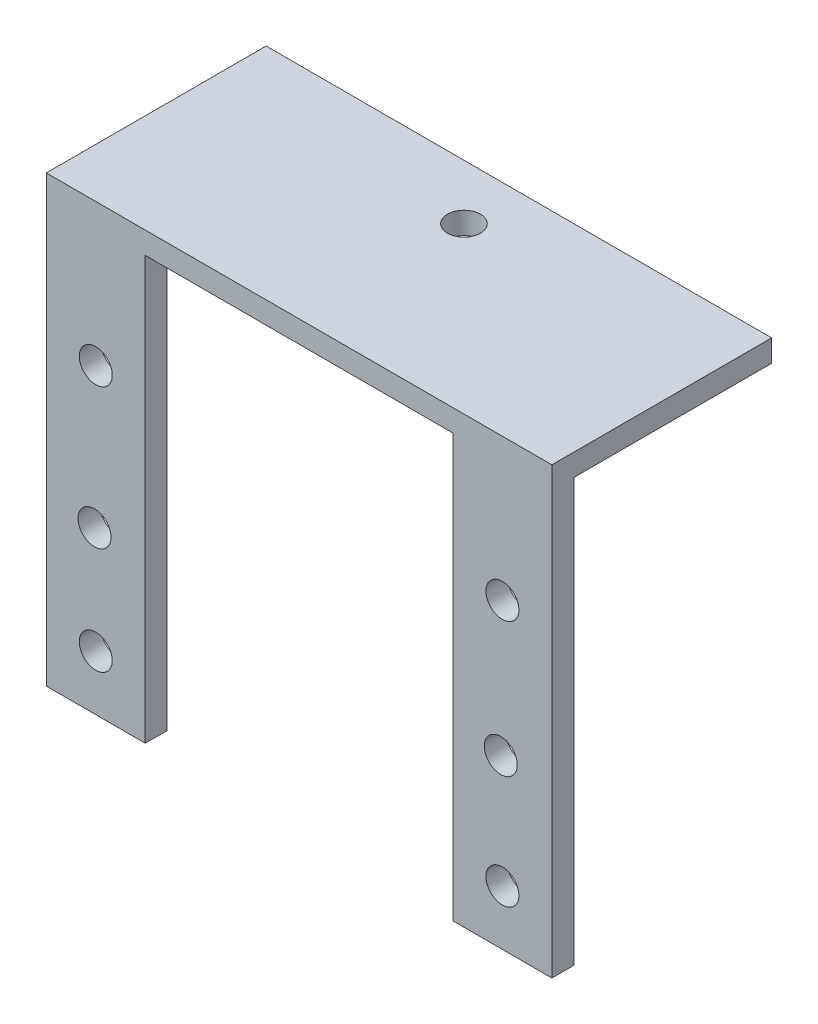
ISO-10303-21;
HEADER;
FILE_DESCRIPTION(('STEP AP214'),'2;1');
FILE_NAME('part.step','',(''),(''),'','','');
FILE_SCHEMA(('AUTOMOTIVE_DESIGN { 1 0 10303 214 1 1 1 1 }'));
ENDSEC;
DATA;
#1=APPLICATION_CONTEXT('core data for automotive mechanical design processes');
#2=APPLICATION_PROTOCOL_DEFINITION('international standard','automotive_design',2000,#1);
#3=PRODUCT_CONTEXT('',#1,'mechanical');
#4=PRODUCT('Part','Part','',(#3));
#5=PRODUCT_RELATED_PRODUCT_CATEGORY('part','',(#4));
#6=PRODUCT_DEFINITION_FORMATION('','',#4);
#7=PRODUCT_DEFINITION_CONTEXT('part definition',#1,'design');
#8=PRODUCT_DEFINITION('design','',#6,#7);
#9=PRODUCT_DEFINITION_SHAPE('','',#8);
#10=(LENGTH_UNIT() NAMED_UNIT(*) SI_UNIT(.MILLI.,.METRE.));
#11=(NAMED_UNIT(*) PLANE_ANGLE_UNIT() SI_UNIT($,.RADIAN.));
#12=(NAMED_UNIT(*) SI_UNIT($,.STERADIAN.) SOLID_ANGLE_UNIT());
#13=UNCERTAINTY_MEASURE_WITH_UNIT(LENGTH_MEASURE(1.E-05),#10,'distance_accuracy_value','');
#14=(GEOMETRIC_REPRESENTATION_CONTEXT(3) GLOBAL_UNCERTAINTY_ASSIGNED_CONTEXT((#13)) GLOBAL_UNIT_ASSIGNED_CONTEXT((#10,
#11,#12)) REPRESENTATION_CONTEXT('',''));
#15=CARTESIAN_POINT('',(0.,0.,0.));
#16=DIRECTION('',(0.,0.,1.));
#17=DIRECTION('',(1.,0.,0.));
#18=AXIS2_PLACEMENT_3D('',#15,#16,#17);
#19=CARTESIAN_POINT('',(0.,4.,0.));
#20=DIRECTION('',(0.,-1.,0.));
#21=DIRECTION('',(0.,0.,-1.));
#22=AXIS2_PLACEMENT_3D('',#19,#20,#21);
#23=PLANE('',#22);
#24=CARTESIAN_POINT('',(-2.51580828835598,4.,-13.));
#25=DIRECTION('',(0.,1.,0.));
#26=DIRECTION('',(0.,0.,1.));
#27=AXIS2_PLACEMENT_3D('',#24,#25,#26);
#28=CIRCLE('',#27,1.5);
#29=CARTESIAN_POINT('',(-2.51580828835598,4.,-11.5));
#30=VERTEX_POINT('',#29);
#31=EDGE_CURVE('E176',#30,#30,#28,.T.);
#32=ORIENTED_EDGE('',*,*,#31,.T.);
#33=EDGE_LOOP('',(#32));
#34=FACE_BOUND('',#33,.T.);
#35=DIRECTION('',(0.,0.,-1.));
#36=VECTOR('',#35,1.);
#37=CARTESIAN_POINT('',(20.484191711644,4.,2.));
#38=LINE('',#37,#36);
#39=CARTESIAN_POINT('',(20.484191711644,4.,0.));
#40=VERTEX_POINT('',#39);
#41=CARTESIAN_POINT('',(20.484191711644,4.,-18.));
#42=VERTEX_POINT('',#41);
#43=EDGE_CURVE('E210',#40,#42,#38,.T.);
#44=ORIENTED_EDGE('',*,*,#43,.F.);
#45=DIRECTION('',(-1.,0.,0.));
#46=VECTOR('',#45,1.);
#47=CARTESIAN_POINT('',(0.,4.,0.));
#48=LINE('',#47,#46);
#49=CARTESIAN_POINT('',(11.484191711644,4.,0.));
#50=VERTEX_POINT('',#49);
#51=EDGE_CURVE('E172',#40,#50,#48,.T.);
#52=ORIENTED_EDGE('',*,*,#51,.T.);
#53=DIRECTION('',(0.,0.,1.));
#54=VECTOR('',#53,1.);
#55=CARTESIAN_POINT('',(11.484191711644,4.,0.));
#56=LINE('',#55,#54);
#57=CARTESIAN_POINT('',(11.484191711644,4.,2.));
#58=VERTEX_POINT('',#57);
#59=EDGE_CURVE('E11',#50,#58,#56,.T.);
#60=ORIENTED_EDGE('',*,*,#59,.T.);
#61=DIRECTION('',(1.,0.,0.));
#62=VECTOR('',#61,1.);
#63=CARTESIAN_POINT('',(-25.515808288356,4.,2.));
#64=LINE('',#63,#62);
#65=CARTESIAN_POINT('',(-16.515808288356,4.,2.));
#66=VERTEX_POINT('',#65);
#67=EDGE_CURVE('E206',#66,#58,#64,.T.);
#68=ORIENTED_EDGE('',*,*,#67,.F.);
#69=DIRECTION('',(0.,0.,1.));
#70=VECTOR('',#69,1.);
#71=CARTESIAN_POINT('',(-16.515808288356,4.,2.));
#72=LINE('',#71,#70);
#73=CARTESIAN_POINT('',(-16.515808288356,4.,0.));
#74=VERTEX_POINT('',#73);
#75=EDGE_CURVE('E228',#74,#66,#72,.T.);
#76=ORIENTED_EDGE('',*,*,#75,.F.);
#77=DIRECTION('',(1.,0.,0.));
#78=VECTOR('',#77,1.);
#79=CARTESIAN_POINT('',(0.,4.,0.));
#80=LINE('',#79,#78);
#81=CARTESIAN_POINT('',(-25.515808288356,4.,0.));
#82=VERTEX_POINT('',#81);
#83=EDGE_CURVE('E100',#82,#74,#80,.T.);
#84=ORIENTED_EDGE('',*,*,#83,.F.);
#85=DIRECTION('',(0.,0.,1.));
#86=VECTOR('',#85,1.);
#87=CARTESIAN_POINT('',(-25.515808288356,4.,2.));
#88=LINE('',#87,#86);
#89=CARTESIAN_POINT('',(-25.515808288356,4.,-18.));
#90=VERTEX_POINT('',#89);
#91=EDGE_CURVE('E181',#90,#82,#88,.T.);
#92=ORIENTED_EDGE('',*,*,#91,.F.);
#93=DIRECTION('',(-1.,0.,0.));
#94=VECTOR('',#93,1.);
#95=CARTESIAN_POINT('',(-25.515808288356,4.,-18.));
#96=LINE('',#95,#94);
#97=EDGE_CURVE('E190',#42,#90,#96,.T.);
#98=ORIENTED_EDGE('',*,*,#97,.F.);
#99=EDGE_LOOP('',(#44,#52,#60,#68,#76,#84,#92,#98));
#100=FACE_BOUND('',#99,.T.);
#101=ADVANCED_FACE('F38',(#34,#100),#23,.T.);
#102=CARTESIAN_POINT('',(0.,0.,2.));
#103=DIRECTION('',(0.,0.,1.));
#104=DIRECTION('',(1.,0.,0.));
#105=AXIS2_PLACEMENT_3D('',#102,#103,#104);
#106=PLANE('',#105);
#107=CARTESIAN_POINT('',(-21.1275313154005,-19.770890516682,2.));
#108=DIRECTION('',(0.,0.,1.));
#109=DIRECTION('',(1.,0.,0.));
#110=AXIS2_PLACEMENT_3D('',#107,#108,#109);
#111=CIRCLE('',#110,1.5);
#112=CARTESIAN_POINT('',(-19.6275313154005,-19.770890516682,2.));
#113=VERTEX_POINT('',#112);
#114=EDGE_CURVE('E132',#113,#113,#111,.T.);
#115=ORIENTED_EDGE('',*,*,#114,.F.);
#116=EDGE_LOOP('',(#115));
#117=FACE_BOUND('',#116,.T.);
#118=CARTESIAN_POINT('',(15.8340917018336,-19.2316304957956,2.));
#119=DIRECTION('',(0.,0.,1.));
#120=DIRECTION('',(1.,0.,0.));
#121=AXIS2_PLACEMENT_3D('',#118,#119,#120);
#122=CIRCLE('',#121,1.5);
#123=CARTESIAN_POINT('',(17.3340917018336,-19.2316304957956,2.));
#124=VERTEX_POINT('',#123);
#125=EDGE_CURVE('E118',#124,#124,#122,.T.);
#126=ORIENTED_EDGE('',*,*,#125,.F.);
#127=EDGE_LOOP('',(#126));
#128=FACE_BOUND('',#127,.T.);
#129=DIRECTION('',(1.,0.,0.));
#130=VECTOR('',#129,1.);
#131=CARTESIAN_POINT('',(20.484191711644,-34.4383287652777,2.));
#132=LINE('',#131,#130);
#133=CARTESIAN_POINT('',(11.484191711644,-34.4383287652777,2.));
#134=VERTEX_POINT('',#133);
#135=CARTESIAN_POINT('',(20.484191711644,-34.4383287652777,2.));
#136=VERTEX_POINT('',#135);
#137=EDGE_CURVE('E149',#134,#136,#132,.T.);
#138=ORIENTED_EDGE('',*,*,#137,.T.);
#139=DIRECTION('',(0.,-1.,0.));
#140=VECTOR('',#139,1.);
#141=CARTESIAN_POINT('',(20.484191711644,6.,2.));
#142=LINE('',#141,#140);
#143=CARTESIAN_POINT('',(20.484191711644,6.,2.));
#144=VERTEX_POINT('',#143);
#145=EDGE_CURVE('E224',#144,#136,#142,.T.);
#146=ORIENTED_EDGE('',*,*,#145,.F.);
#147=DIRECTION('',(1.,0.,0.));
#148=VECTOR('',#147,1.);
#149=CARTESIAN_POINT('',(-25.515808288356,6.,2.));
#150=LINE('',#149,#148);
#151=CARTESIAN_POINT('',(-25.515808288356,6.,2.));
#152=VERTEX_POINT('',#151);
#153=EDGE_CURVE('E189',#152,#144,#150,.T.);
#154=ORIENTED_EDGE('',*,*,#153,.F.);
#155=DIRECTION('',(0.,-1.,0.));
#156=VECTOR('',#155,1.);
#157=CARTESIAN_POINT('',(-25.515808288356,-34.4383287652777,2.));
#158=LINE('',#157,#156);
#159=CARTESIAN_POINT('',(-25.515808288356,-34.4383287652777,2.));
#160=VERTEX_POINT('',#159);
#161=EDGE_CURVE('E245',#152,#160,#158,.T.);
#162=ORIENTED_EDGE('',*,*,#161,.T.);
#163=DIRECTION('',(1.,0.,0.));
#164=VECTOR('',#163,1.);
#165=CARTESIAN_POINT('',(-16.515808288356,-34.4383287652777,2.));
#166=LINE('',#165,#164);
#167=CARTESIAN_POINT('',(-16.515808288356,-34.4383287652777,2.));
#168=VERTEX_POINT('',#167);
#169=EDGE_CURVE('E64',#160,#168,#166,.T.);
#170=ORIENTED_EDGE('',*,*,#169,.T.);
#171=DIRECTION('',(0.,1.,0.));
#172=VECTOR('',#171,1.);
#173=CARTESIAN_POINT('',(-16.515808288356,-34.4383287652777,2.));
#174=LINE('',#173,#172);
#175=EDGE_CURVE('E87',#168,#66,#174,.T.);
#176=ORIENTED_EDGE('',*,*,#175,.T.);
#177=ORIENTED_EDGE('',*,*,#67,.T.);
#178=DIRECTION('',(0.,-1.,0.));
#179=VECTOR('',#178,1.);
#180=CARTESIAN_POINT('',(11.484191711644,-34.4383287652777,2.));
#181=LINE('',#180,#179);
#182=EDGE_CURVE('E56',#58,#134,#181,.T.);
#183=ORIENTED_EDGE('',*,*,#182,.T.);
#184=EDGE_LOOP('',(#138,#146,#154,#162,#170,#176,#177,#183));
#185=FACE_BOUND('',#184,.T.);
#186=CARTESIAN_POINT('',(15.984191711644,-29.4383287652777,2.));
#187=DIRECTION('',(0.,0.,1.));
#188=DIRECTION('',(1.,0.,0.));
#189=AXIS2_PLACEMENT_3D('',#186,#187,#188);
#190=CIRCLE('',#189,1.5);
#191=CARTESIAN_POINT('',(17.484191711644,-29.4383287652777,2.));
#192=VERTEX_POINT('',#191);
#193=EDGE_CURVE('E139',#192,#192,#190,.T.);
#194=ORIENTED_EDGE('',*,*,#193,.F.);
#195=EDGE_LOOP('',(#194));
#196=FACE_BOUND('',#195,.T.);
#197=CARTESIAN_POINT('',(15.984191711644,-6.93832876527765,2.));
#198=DIRECTION('',(0.,0.,1.));
#199=DIRECTION('',(1.,0.,0.));
#200=AXIS2_PLACEMENT_3D('',#197,#198,#199);
#201=CIRCLE('',#200,1.5);
#202=CARTESIAN_POINT('',(17.484191711644,-6.93832876527765,2.));
#203=VERTEX_POINT('',#202);
#204=EDGE_CURVE('E124',#203,#203,#201,.T.);
#205=ORIENTED_EDGE('',*,*,#204,.F.);
#206=EDGE_LOOP('',(#205));
#207=FACE_BOUND('',#206,.T.);
#208=CARTESIAN_POINT('',(-21.015808288356,-29.4383287652777,2.));
#209=DIRECTION('',(0.,0.,1.));
#210=DIRECTION('',(1.,0.,0.));
#211=AXIS2_PLACEMENT_3D('',#208,#209,#210);
#212=CIRCLE('',#211,1.5);
#213=CARTESIAN_POINT('',(-19.515808288356,-29.4383287652777,2.));
#214=VERTEX_POINT('',#213);
#215=EDGE_CURVE('E102',#214,#214,#212,.T.);
#216=ORIENTED_EDGE('',*,*,#215,.F.);
#217=EDGE_LOOP('',(#216));
#218=FACE_BOUND('',#217,.T.);
#219=CARTESIAN_POINT('',(-21.015808288356,-6.93832876527765,2.));
#220=DIRECTION('',(0.,0.,1.));
#221=DIRECTION('',(1.,0.,0.));
#222=AXIS2_PLACEMENT_3D('',#219,#220,#221);
#223=CIRCLE('',#222,1.5);
#224=CARTESIAN_POINT('',(-19.515808288356,-6.93832876527765,2.));
#225=VERTEX_POINT('',#224);
#226=EDGE_CURVE('E234',#225,#225,#223,.T.);
#227=ORIENTED_EDGE('',*,*,#226,.F.);
#228=EDGE_LOOP('',(#227));
#229=FACE_BOUND('',#228,.T.);
#230=ADVANCED_FACE('F250',(#117,#128,#185,#196,#207,#218,#229),#106,.T.);
#231=CARTESIAN_POINT('',(0.,0.,0.));
#232=DIRECTION('',(0.,0.,1.));
#233=DIRECTION('',(1.,0.,0.));
#234=AXIS2_PLACEMENT_3D('',#231,#232,#233);
#235=PLANE('',#234);
#236=CARTESIAN_POINT('',(-21.1275313154005,-19.770890516682,0.));
#237=DIRECTION('',(0.,0.,1.));
#238=DIRECTION('',(1.,0.,0.));
#239=AXIS2_PLACEMENT_3D('',#236,#237,#238);
#240=CIRCLE('',#239,1.5);
#241=CARTESIAN_POINT('',(-19.6275313154005,-19.770890516682,0.));
#242=VERTEX_POINT('',#241);
#243=EDGE_CURVE('E42',#242,#242,#240,.T.);
#244=ORIENTED_EDGE('',*,*,#243,.T.);
#245=EDGE_LOOP('',(#244));
#246=FACE_BOUND('',#245,.T.);
#247=DIRECTION('',(0.,-1.,0.));
#248=VECTOR('',#247,1.);
#249=CARTESIAN_POINT('',(-25.515808288356,-34.4383287652777,0.));
#250=LINE('',#249,#248);
#251=CARTESIAN_POINT('',(-25.515808288356,-34.4383287652777,0.));
#252=VERTEX_POINT('',#251);
#253=EDGE_CURVE('E88',#82,#252,#250,.T.);
#254=ORIENTED_EDGE('',*,*,#253,.F.);
#255=ORIENTED_EDGE('',*,*,#83,.T.);
#256=DIRECTION('',(0.,1.,0.));
#257=VECTOR('',#256,1.);
#258=CARTESIAN_POINT('',(-16.515808288356,-34.4383287652777,0.));
#259=LINE('',#258,#257);
#260=CARTESIAN_POINT('',(-16.515808288356,-34.4383287652777,0.));
#261=VERTEX_POINT('',#260);
#262=EDGE_CURVE('E93',#261,#74,#259,.T.);
#263=ORIENTED_EDGE('',*,*,#262,.F.);
#264=DIRECTION('',(1.,0.,0.));
#265=VECTOR('',#264,1.);
#266=CARTESIAN_POINT('',(-16.515808288356,-34.4383287652777,0.));
#267=LINE('',#266,#265);
#268=EDGE_CURVE('E77',#252,#261,#267,.T.);
#269=ORIENTED_EDGE('',*,*,#268,.F.);
#270=EDGE_LOOP('',(#254,#255,#263,#269));
#271=FACE_BOUND('',#270,.T.);
#272=CARTESIAN_POINT('',(-21.015808288356,-29.4383287652777,0.));
#273=DIRECTION('',(0.,0.,1.));
#274=DIRECTION('',(1.,0.,0.));
#275=AXIS2_PLACEMENT_3D('',#272,#273,#274);
#276=CIRCLE('',#275,1.5);
#277=CARTESIAN_POINT('',(-19.515808288356,-29.4383287652777,0.));
#278=VERTEX_POINT('',#277);
#279=EDGE_CURVE('E108',#278,#278,#276,.T.);
#280=ORIENTED_EDGE('',*,*,#279,.T.);
#281=EDGE_LOOP('',(#280));
#282=FACE_BOUND('',#281,.T.);
#283=CARTESIAN_POINT('',(-21.015808288356,-6.93832876527765,0.));
#284=DIRECTION('',(0.,0.,1.));
#285=DIRECTION('',(1.,0.,0.));
#286=AXIS2_PLACEMENT_3D('',#283,#284,#285);
#287=CIRCLE('',#286,1.5);
#288=CARTESIAN_POINT('',(-19.515808288356,-6.93832876527765,0.));
#289=VERTEX_POINT('',#288);
#290=EDGE_CURVE('E233',#289,#289,#287,.T.);
#291=ORIENTED_EDGE('',*,*,#290,.T.);
#292=EDGE_LOOP('',(#291));
#293=FACE_BOUND('',#292,.T.);
#294=ADVANCED_FACE('F97',(#246,#271,#282,#293),#235,.F.);
#295=CARTESIAN_POINT('',(-16.515808288356,-34.4383287652777,2.));
#296=DIRECTION('',(-1.,0.,0.));
#297=DIRECTION('',(0.,0.,1.));
#298=AXIS2_PLACEMENT_3D('',#295,#296,#297);
#299=PLANE('',#298);
#300=ORIENTED_EDGE('',*,*,#262,.T.);
#301=ORIENTED_EDGE('',*,*,#75,.T.);
#302=ORIENTED_EDGE('',*,*,#175,.F.);
#303=DIRECTION('',(0.,0.,-1.));
#304=VECTOR('',#303,1.);
#305=CARTESIAN_POINT('',(-16.515808288356,-34.4383287652777,2.));
#306=LINE('',#305,#304);
#307=EDGE_CURVE('E80',#168,#261,#306,.T.);
#308=ORIENTED_EDGE('',*,*,#307,.T.);
#309=EDGE_LOOP('',(#300,#301,#302,#308));
#310=FACE_BOUND('',#309,.T.);
#311=ADVANCED_FACE('F40',(#310),#299,.F.);
#312=CARTESIAN_POINT('',(-25.515808288356,-34.4383287652777,2.));
#313=DIRECTION('',(1.,0.,0.));
#314=DIRECTION('',(0.,0.,-1.));
#315=AXIS2_PLACEMENT_3D('',#312,#313,#314);
#316=PLANE('',#315);
#317=ORIENTED_EDGE('',*,*,#91,.T.);
#318=ORIENTED_EDGE('',*,*,#253,.T.);
#319=DIRECTION('',(0.,0.,-1.));
#320=VECTOR('',#319,1.);
#321=CARTESIAN_POINT('',(-25.515808288356,-34.4383287652777,2.));
#322=LINE('',#321,#320);
#323=EDGE_CURVE('E48',#160,#252,#322,.T.);
#324=ORIENTED_EDGE('',*,*,#323,.F.);
#325=ORIENTED_EDGE('',*,*,#161,.F.);
#326=DIRECTION('',(0.,0.,1.));
#327=VECTOR('',#326,1.);
#328=CARTESIAN_POINT('',(-25.515808288356,6.,2.));
#329=LINE('',#328,#327);
#330=CARTESIAN_POINT('',(-25.515808288356,6.,-18.));
#331=VERTEX_POINT('',#330);
#332=EDGE_CURVE('E185',#331,#152,#329,.T.);
#333=ORIENTED_EDGE('',*,*,#332,.F.);
#334=DIRECTION('',(0.,-1.,0.));
#335=VECTOR('',#334,1.);
#336=CARTESIAN_POINT('',(-25.515808288356,6.,-18.));
#337=LINE('',#336,#335);
#338=EDGE_CURVE('E202',#331,#90,#337,.T.);
#339=ORIENTED_EDGE('',*,*,#338,.T.);
#340=EDGE_LOOP('',(#317,#318,#324,#325,#333,#339));
#341=FACE_BOUND('',#340,.T.);
#342=ADVANCED_FACE('F256',(#341),#316,.F.);
#343=CARTESIAN_POINT('',(-16.515808288356,-34.4383287652777,2.));
#344=DIRECTION('',(0.,1.,0.));
#345=DIRECTION('',(0.,0.,1.));
#346=AXIS2_PLACEMENT_3D('',#343,#344,#345);
#347=PLANE('',#346);
#348=ORIENTED_EDGE('',*,*,#268,.T.);
#349=ORIENTED_EDGE('',*,*,#307,.F.);
#350=ORIENTED_EDGE('',*,*,#169,.F.);
#351=ORIENTED_EDGE('',*,*,#323,.T.);
#352=EDGE_LOOP('',(#348,#349,#350,#351));
#353=FACE_BOUND('',#352,.T.);
#354=ADVANCED_FACE('F79',(#353),#347,.F.);
#355=CARTESIAN_POINT('',(-21.015808288356,-29.4383287652777,2.));
#356=DIRECTION('',(0.,0.,-1.));
#357=DIRECTION('',(-1.,0.,0.));
#358=AXIS2_PLACEMENT_3D('',#355,#356,#357);
#359=CYLINDRICAL_SURFACE('',#358,1.5);
#360=ORIENTED_EDGE('',*,*,#215,.T.);
#361=EDGE_LOOP('',(#360));
#362=FACE_BOUND('',#361,.T.);
#363=ORIENTED_EDGE('',*,*,#279,.F.);
#364=EDGE_LOOP('',(#363));
#365=FACE_BOUND('',#364,.T.);
#366=ADVANCED_FACE('F339',(#362,#365),#359,.F.);
#367=CARTESIAN_POINT('',(-21.015808288356,-6.93832876527765,2.));
#368=DIRECTION('',(0.,0.,-1.));
#369=DIRECTION('',(-1.,0.,0.));
#370=AXIS2_PLACEMENT_3D('',#367,#368,#369);
#371=CYLINDRICAL_SURFACE('',#370,1.5);
#372=ORIENTED_EDGE('',*,*,#226,.T.);
#373=EDGE_LOOP('',(#372));
#374=FACE_BOUND('',#373,.T.);
#375=ORIENTED_EDGE('',*,*,#290,.F.);
#376=EDGE_LOOP('',(#375));
#377=FACE_BOUND('',#376,.T.);
#378=ADVANCED_FACE('F314',(#374,#377),#371,.F.);
#379=CARTESIAN_POINT('',(0.,6.,0.));
#380=DIRECTION('',(0.,-1.,0.));
#381=DIRECTION('',(0.,0.,-1.));
#382=AXIS2_PLACEMENT_3D('',#379,#380,#381);
#383=PLANE('',#382);
#384=ORIENTED_EDGE('',*,*,#332,.T.);
#385=ORIENTED_EDGE('',*,*,#153,.T.);
#386=DIRECTION('',(0.,0.,-1.));
#387=VECTOR('',#386,1.);
#388=CARTESIAN_POINT('',(20.484191711644,6.,2.));
#389=LINE('',#388,#387);
#390=CARTESIAN_POINT('',(20.484191711644,6.,-18.));
#391=VERTEX_POINT('',#390);
#392=EDGE_CURVE('E194',#144,#391,#389,.T.);
#393=ORIENTED_EDGE('',*,*,#392,.T.);
#394=DIRECTION('',(-1.,0.,0.));
#395=VECTOR('',#394,1.);
#396=CARTESIAN_POINT('',(-25.515808288356,6.,-18.));
#397=LINE('',#396,#395);
#398=EDGE_CURVE('E198',#391,#331,#397,.T.);
#399=ORIENTED_EDGE('',*,*,#398,.T.);
#400=EDGE_LOOP('',(#384,#385,#393,#399));
#401=FACE_BOUND('',#400,.T.);
#402=CARTESIAN_POINT('',(-2.51580828835598,6.,-13.));
#403=DIRECTION('',(0.,1.,0.));
#404=DIRECTION('',(0.,0.,1.));
#405=AXIS2_PLACEMENT_3D('',#402,#403,#404);
#406=CIRCLE('',#405,1.5);
#407=CARTESIAN_POINT('',(-2.51580828835598,6.,-11.5));
#408=VERTEX_POINT('',#407);
#409=EDGE_CURVE('E177',#408,#408,#406,.T.);
#410=ORIENTED_EDGE('',*,*,#409,.F.);
#411=EDGE_LOOP('',(#410));
#412=FACE_BOUND('',#411,.T.);
#413=ADVANCED_FACE('F311',(#401,#412),#383,.F.);
#414=CARTESIAN_POINT('',(20.484191711644,6.,2.));
#415=DIRECTION('',(-1.,0.,0.));
#416=DIRECTION('',(0.,0.,1.));
#417=AXIS2_PLACEMENT_3D('',#414,#415,#416);
#418=PLANE('',#417);
#419=ORIENTED_EDGE('',*,*,#145,.T.);
#420=DIRECTION('',(0.,0.,-1.));
#421=VECTOR('',#420,1.);
#422=CARTESIAN_POINT('',(20.484191711644,-34.4383287652777,2.));
#423=LINE('',#422,#421);
#424=CARTESIAN_POINT('',(20.484191711644,-34.4383287652777,0.));
#425=VERTEX_POINT('',#424);
#426=EDGE_CURVE('E154',#136,#425,#423,.T.);
#427=ORIENTED_EDGE('',*,*,#426,.T.);
#428=DIRECTION('',(0.,1.,0.));
#429=VECTOR('',#428,1.);
#430=CARTESIAN_POINT('',(20.484191711644,-34.4383287652777,0.));
#431=LINE('',#430,#429);
#432=EDGE_CURVE('E143',#425,#40,#431,.T.);
#433=ORIENTED_EDGE('',*,*,#432,.T.);
#434=ORIENTED_EDGE('',*,*,#43,.T.);
#435=DIRECTION('',(0.,-1.,0.));
#436=VECTOR('',#435,1.);
#437=CARTESIAN_POINT('',(20.484191711644,6.,-18.));
#438=LINE('',#437,#436);
#439=EDGE_CURVE('E220',#391,#42,#438,.T.);
#440=ORIENTED_EDGE('',*,*,#439,.F.);
#441=ORIENTED_EDGE('',*,*,#392,.F.);
#442=EDGE_LOOP('',(#419,#427,#433,#434,#440,#441));
#443=FACE_BOUND('',#442,.T.);
#444=ADVANCED_FACE('F298',(#443),#418,.F.);
#445=CARTESIAN_POINT('',(-25.515808288356,6.,-18.));
#446=DIRECTION('',(0.,0.,1.));
#447=DIRECTION('',(1.,0.,0.));
#448=AXIS2_PLACEMENT_3D('',#445,#446,#447);
#449=PLANE('',#448);
#450=ORIENTED_EDGE('',*,*,#97,.T.);
#451=ORIENTED_EDGE('',*,*,#338,.F.);
#452=ORIENTED_EDGE('',*,*,#398,.F.);
#453=ORIENTED_EDGE('',*,*,#439,.T.);
#454=EDGE_LOOP('',(#450,#451,#452,#453));
#455=FACE_BOUND('',#454,.T.);
#456=ADVANCED_FACE('F308',(#455),#449,.F.);
#457=CARTESIAN_POINT('',(-2.51580828835598,6.,-13.));
#458=DIRECTION('',(0.,-1.,0.));
#459=DIRECTION('',(0.,0.,-1.));
#460=AXIS2_PLACEMENT_3D('',#457,#458,#459);
#461=CYLINDRICAL_SURFACE('',#460,1.5);
#462=ORIENTED_EDGE('',*,*,#409,.T.);
#463=EDGE_LOOP('',(#462));
#464=FACE_BOUND('',#463,.T.);
#465=ORIENTED_EDGE('',*,*,#31,.F.);
#466=EDGE_LOOP('',(#465));
#467=FACE_BOUND('',#466,.T.);
#468=ADVANCED_FACE('F318',(#464,#467),#461,.F.);
#469=CARTESIAN_POINT('',(0.,0.,0.));
#470=DIRECTION('',(0.,0.,1.));
#471=DIRECTION('',(1.,0.,0.));
#472=AXIS2_PLACEMENT_3D('',#469,#470,#471);
#473=PLANE('',#472);
#474=CARTESIAN_POINT('',(15.8340917018336,-19.2316304957956,0.));
#475=DIRECTION('',(0.,0.,1.));
#476=DIRECTION('',(1.,0.,0.));
#477=AXIS2_PLACEMENT_3D('',#474,#475,#476);
#478=CIRCLE('',#477,1.5);
#479=CARTESIAN_POINT('',(17.3340917018336,-19.2316304957956,0.));
#480=VERTEX_POINT('',#479);
#481=EDGE_CURVE('E114',#480,#480,#478,.T.);
#482=ORIENTED_EDGE('',*,*,#481,.T.);
#483=EDGE_LOOP('',(#482));
#484=FACE_BOUND('',#483,.T.);
#485=ORIENTED_EDGE('',*,*,#51,.F.);
#486=ORIENTED_EDGE('',*,*,#432,.F.);
#487=DIRECTION('',(1.,0.,0.));
#488=VECTOR('',#487,1.);
#489=CARTESIAN_POINT('',(20.484191711644,-34.4383287652777,0.));
#490=LINE('',#489,#488);
#491=CARTESIAN_POINT('',(11.484191711644,-34.4383287652777,0.));
#492=VERTEX_POINT('',#491);
#493=EDGE_CURVE('E150',#492,#425,#490,.T.);
#494=ORIENTED_EDGE('',*,*,#493,.F.);
#495=DIRECTION('',(0.,-1.,0.));
#496=VECTOR('',#495,1.);
#497=CARTESIAN_POINT('',(11.484191711644,-34.4383287652777,0.));
#498=LINE('',#497,#496);
#499=EDGE_CURVE('E158',#50,#492,#498,.T.);
#500=ORIENTED_EDGE('',*,*,#499,.F.);
#501=EDGE_LOOP('',(#485,#486,#494,#500));
#502=FACE_BOUND('',#501,.T.);
#503=CARTESIAN_POINT('',(15.984191711644,-29.4383287652777,0.));
#504=DIRECTION('',(0.,0.,1.));
#505=DIRECTION('',(1.,0.,0.));
#506=AXIS2_PLACEMENT_3D('',#503,#504,#505);
#507=CIRCLE('',#506,1.5);
#508=CARTESIAN_POINT('',(17.484191711644,-29.4383287652777,0.));
#509=VERTEX_POINT('',#508);
#510=EDGE_CURVE('E137',#509,#509,#507,.T.);
#511=ORIENTED_EDGE('',*,*,#510,.T.);
#512=EDGE_LOOP('',(#511));
#513=FACE_BOUND('',#512,.T.);
#514=CARTESIAN_POINT('',(15.984191711644,-6.93832876527765,0.));
#515=DIRECTION('',(0.,0.,1.));
#516=DIRECTION('',(1.,0.,0.));
#517=AXIS2_PLACEMENT_3D('',#514,#515,#516);
#518=CIRCLE('',#517,1.5);
#519=CARTESIAN_POINT('',(17.484191711644,-6.93832876527765,0.));
#520=VERTEX_POINT('',#519);
#521=EDGE_CURVE('E117',#520,#520,#518,.T.);
#522=ORIENTED_EDGE('',*,*,#521,.T.);
#523=EDGE_LOOP('',(#522));
#524=FACE_BOUND('',#523,.T.);
#525=ADVANCED_FACE('F302',(#484,#502,#513,#524),#473,.F.);
#526=CARTESIAN_POINT('',(11.484191711644,-34.4383287652777,2.));
#527=DIRECTION('',(1.,0.,0.));
#528=DIRECTION('',(0.,1.,0.));
#529=AXIS2_PLACEMENT_3D('',#526,#527,#528);
#530=PLANE('',#529);
#531=ORIENTED_EDGE('',*,*,#59,.F.);
#532=ORIENTED_EDGE('',*,*,#499,.T.);
#533=DIRECTION('',(0.,0.,-1.));
#534=VECTOR('',#533,1.);
#535=CARTESIAN_POINT('',(11.484191711644,-34.4383287652777,2.));
#536=LINE('',#535,#534);
#537=EDGE_CURVE('E168',#134,#492,#536,.T.);
#538=ORIENTED_EDGE('',*,*,#537,.F.);
#539=ORIENTED_EDGE('',*,*,#182,.F.);
#540=EDGE_LOOP('',(#531,#532,#538,#539));
#541=FACE_BOUND('',#540,.T.);
#542=ADVANCED_FACE('F291',(#541),#530,.F.);
#543=CARTESIAN_POINT('',(20.484191711644,-34.4383287652777,2.));
#544=DIRECTION('',(0.,1.,0.));
#545=DIRECTION('',(0.,0.,1.));
#546=AXIS2_PLACEMENT_3D('',#543,#544,#545);
#547=PLANE('',#546);
#548=ORIENTED_EDGE('',*,*,#493,.T.);
#549=ORIENTED_EDGE('',*,*,#426,.F.);
#550=ORIENTED_EDGE('',*,*,#137,.F.);
#551=ORIENTED_EDGE('',*,*,#537,.T.);
#552=EDGE_LOOP('',(#548,#549,#550,#551));
#553=FACE_BOUND('',#552,.T.);
#554=ADVANCED_FACE('F295',(#553),#547,.F.);
#555=CARTESIAN_POINT('',(15.984191711644,-29.4383287652777,2.));
#556=DIRECTION('',(0.,0.,-1.));
#557=DIRECTION('',(-1.,0.,0.));
#558=AXIS2_PLACEMENT_3D('',#555,#556,#557);
#559=CYLINDRICAL_SURFACE('',#558,1.5);
#560=ORIENTED_EDGE('',*,*,#193,.T.);
#561=EDGE_LOOP('',(#560));
#562=FACE_BOUND('',#561,.T.);
#563=ORIENTED_EDGE('',*,*,#510,.F.);
#564=EDGE_LOOP('',(#563));
#565=FACE_BOUND('',#564,.T.);
#566=ADVANCED_FACE('F398',(#562,#565),#559,.F.);
#567=CARTESIAN_POINT('',(15.984191711644,-6.93832876527765,2.));
#568=DIRECTION('',(0.,0.,-1.));
#569=DIRECTION('',(-1.,0.,0.));
#570=AXIS2_PLACEMENT_3D('',#567,#568,#569);
#571=CYLINDRICAL_SURFACE('',#570,1.5);
#572=ORIENTED_EDGE('',*,*,#204,.T.);
#573=EDGE_LOOP('',(#572));
#574=FACE_BOUND('',#573,.T.);
#575=ORIENTED_EDGE('',*,*,#521,.F.);
#576=EDGE_LOOP('',(#575));
#577=FACE_BOUND('',#576,.T.);
#578=ADVANCED_FACE('F379',(#574,#577),#571,.F.);
#579=CARTESIAN_POINT('',(15.8340917018336,-19.2316304957956,-8.));
#580=DIRECTION('',(0.,0.,1.));
#581=DIRECTION('',(1.,0.,0.));
#582=AXIS2_PLACEMENT_3D('',#579,#580,#581);
#583=CYLINDRICAL_SURFACE('',#582,1.5);
#584=ORIENTED_EDGE('',*,*,#125,.T.);
#585=EDGE_LOOP('',(#584));
#586=FACE_BOUND('',#585,.T.);
#587=ORIENTED_EDGE('',*,*,#481,.F.);
#588=EDGE_LOOP('',(#587));
#589=FACE_BOUND('',#588,.T.);
#590=ADVANCED_FACE('F373',(#586,#589),#583,.F.);
#591=CARTESIAN_POINT('',(-21.1275313154005,-19.770890516682,-8.));
#592=DIRECTION('',(0.,0.,1.));
#593=DIRECTION('',(1.,0.,0.));
#594=AXIS2_PLACEMENT_3D('',#591,#592,#593);
#595=CYLINDRICAL_SURFACE('',#594,1.5);
#596=ORIENTED_EDGE('',*,*,#114,.T.);
#597=EDGE_LOOP('',(#596));
#598=FACE_BOUND('',#597,.T.);
#599=ORIENTED_EDGE('',*,*,#243,.F.);
#600=EDGE_LOOP('',(#599));
#601=FACE_BOUND('',#600,.T.);
#602=ADVANCED_FACE('F378',(#598,#601),#595,.F.);
#603=CLOSED_SHELL('',(#101,#230,#294,#311,#342,#354,#366,#378,#413,#444,#456,#468,#525,#542,
#554,#566,#578,#590,#602));
#604=MANIFOLD_SOLID_BREP('B2',#603);
#605=ADVANCED_BREP_SHAPE_REPRESENTATION('',(#18,#604),#14);
#606=SHAPE_DEFINITION_REPRESENTATION(#9,#605);
ENDSEC;
END-ISO-10303-21;
